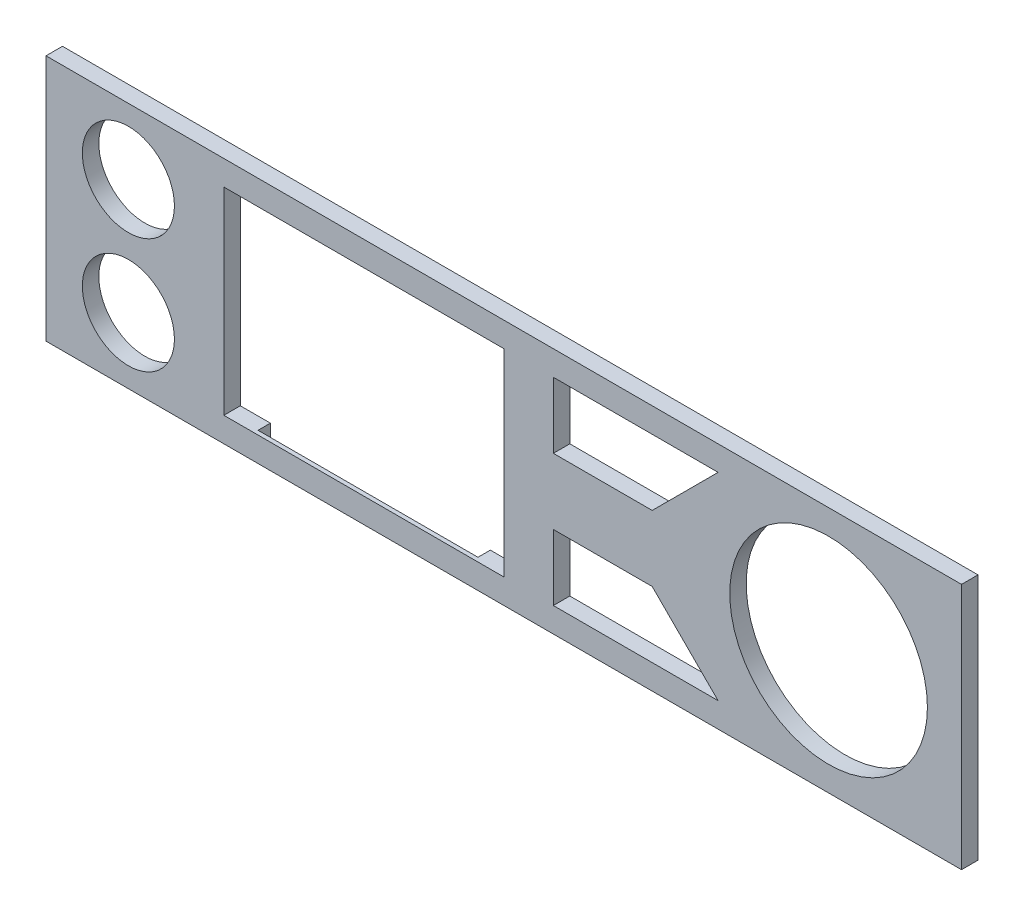
ISO-10303-21;
HEADER;
FILE_DESCRIPTION(('STEP AP214'),'2;1');
FILE_NAME('part.step','',(''),(''),'','','');
FILE_SCHEMA(('AUTOMOTIVE_DESIGN { 1 0 10303 214 1 1 1 1 }'));
ENDSEC;
DATA;
#1=APPLICATION_CONTEXT('core data for automotive mechanical design processes');
#2=APPLICATION_PROTOCOL_DEFINITION('international standard','automotive_design',2000,#1);
#3=PRODUCT_CONTEXT('',#1,'mechanical');
#4=PRODUCT('Part','Part','',(#3));
#5=PRODUCT_RELATED_PRODUCT_CATEGORY('part','',(#4));
#6=PRODUCT_DEFINITION_FORMATION('','',#4);
#7=PRODUCT_DEFINITION_CONTEXT('part definition',#1,'design');
#8=PRODUCT_DEFINITION('design','',#6,#7);
#9=PRODUCT_DEFINITION_SHAPE('','',#8);
#10=(LENGTH_UNIT() NAMED_UNIT(*) SI_UNIT(.MILLI.,.METRE.));
#11=(NAMED_UNIT(*) PLANE_ANGLE_UNIT() SI_UNIT($,.RADIAN.));
#12=(NAMED_UNIT(*) SI_UNIT($,.STERADIAN.) SOLID_ANGLE_UNIT());
#13=UNCERTAINTY_MEASURE_WITH_UNIT(LENGTH_MEASURE(1.E-05),#10,'distance_accuracy_value','');
#14=(GEOMETRIC_REPRESENTATION_CONTEXT(3) GLOBAL_UNCERTAINTY_ASSIGNED_CONTEXT((#13)) GLOBAL_UNIT_ASSIGNED_CONTEXT((#10,
#11,#12)) REPRESENTATION_CONTEXT('',''));
#15=CARTESIAN_POINT('',(0.,0.,0.));
#16=DIRECTION('',(0.,0.,1.));
#17=DIRECTION('',(1.,0.,0.));
#18=AXIS2_PLACEMENT_3D('',#15,#16,#17);
#19=CARTESIAN_POINT('',(0.,0.,2.));
#20=DIRECTION('',(0.,0.,1.));
#21=DIRECTION('',(1.,0.,0.));
#22=AXIS2_PLACEMENT_3D('',#19,#20,#21);
#23=PLANE('',#22);
#24=DIRECTION('',(1.,0.,0.));
#25=VECTOR('',#24,1.);
#26=CARTESIAN_POINT('',(-49.55,2.99999999999999,2.));
#27=LINE('',#26,#25);
#28=CARTESIAN_POINT('',(-49.55,2.99999999999999,2.));
#29=VERTEX_POINT('',#28);
#30=CARTESIAN_POINT('',(-29.55,2.99999999999999,2.));
#31=VERTEX_POINT('',#30);
#32=EDGE_CURVE('E244',#29,#31,#27,.T.);
#33=ORIENTED_EDGE('',*,*,#32,.F.);
#34=DIRECTION('',(0.,-1.,0.));
#35=VECTOR('',#34,1.);
#36=CARTESIAN_POINT('',(-49.55,2.99999999999999,2.));
#37=LINE('',#36,#35);
#38=CARTESIAN_POINT('',(-49.55,11.,2.));
#39=VERTEX_POINT('',#38);
#40=EDGE_CURVE('E242',#39,#29,#37,.T.);
#41=ORIENTED_EDGE('',*,*,#40,.F.);
#42=DIRECTION('',(-1.,0.,0.));
#43=VECTOR('',#42,1.);
#44=CARTESIAN_POINT('',(-49.55,11.,2.));
#45=LINE('',#44,#43);
#46=CARTESIAN_POINT('',(-37.55,11.,2.));
#47=VERTEX_POINT('',#46);
#48=EDGE_CURVE('E250',#47,#39,#45,.T.);
#49=ORIENTED_EDGE('',*,*,#48,.F.);
#50=DIRECTION('',(-0.707106781186548,0.707106781186548,0.));
#51=VECTOR('',#50,1.);
#52=CARTESIAN_POINT('',(-37.55,11.,2.));
#53=LINE('',#52,#51);
#54=EDGE_CURVE('E247',#31,#47,#53,.T.);
#55=ORIENTED_EDGE('',*,*,#54,.F.);
#56=EDGE_LOOP('',(#33,#41,#49,#55));
#57=FACE_BOUND('',#56,.T.);
#58=DIRECTION('',(1.,0.,0.));
#59=VECTOR('',#58,1.);
#60=CARTESIAN_POINT('',(-49.55,19.,2.));
#61=LINE('',#60,#59);
#62=CARTESIAN_POINT('',(-49.55,19.,2.));
#63=VERTEX_POINT('',#62);
#64=CARTESIAN_POINT('',(-37.55,19.,2.));
#65=VERTEX_POINT('',#64);
#66=EDGE_CURVE('E275',#63,#65,#61,.T.);
#67=ORIENTED_EDGE('',*,*,#66,.F.);
#68=DIRECTION('',(0.,-1.,0.));
#69=VECTOR('',#68,1.);
#70=CARTESIAN_POINT('',(-49.55,27.,2.));
#71=LINE('',#70,#69);
#72=CARTESIAN_POINT('',(-49.55,27.,2.));
#73=VERTEX_POINT('',#72);
#74=EDGE_CURVE('E273',#73,#63,#71,.T.);
#75=ORIENTED_EDGE('',*,*,#74,.F.);
#76=DIRECTION('',(-1.,0.,0.));
#77=VECTOR('',#76,1.);
#78=CARTESIAN_POINT('',(-36.596,27.,2.));
#79=LINE('',#78,#77);
#80=CARTESIAN_POINT('',(-29.55,27.,2.));
#81=VERTEX_POINT('',#80);
#82=EDGE_CURVE('E281',#81,#73,#79,.T.);
#83=ORIENTED_EDGE('',*,*,#82,.F.);
#84=DIRECTION('',(0.707106781186548,0.707106781186547,0.));
#85=VECTOR('',#84,1.);
#86=CARTESIAN_POINT('',(-29.55,27.,2.));
#87=LINE('',#86,#85);
#88=EDGE_CURVE('E278',#65,#81,#87,.T.);
#89=ORIENTED_EDGE('',*,*,#88,.F.);
#90=EDGE_LOOP('',(#67,#75,#83,#89));
#91=FACE_BOUND('',#90,.T.);
#92=CARTESIAN_POINT('',(-101.14,7.99999999999999,2.));
#93=DIRECTION('',(0.,0.,1.));
#94=DIRECTION('',(1.,0.,0.));
#95=AXIS2_PLACEMENT_3D('',#92,#93,#94);
#96=CIRCLE('',#95,5.59);
#97=CARTESIAN_POINT('',(-95.55,7.99999999999999,2.));
#98=VERTEX_POINT('',#97);
#99=EDGE_CURVE('E305',#98,#98,#96,.T.);
#100=ORIENTED_EDGE('',*,*,#99,.F.);
#101=EDGE_LOOP('',(#100));
#102=FACE_BOUND('',#101,.T.);
#103=DIRECTION('',(0.,1.,0.));
#104=VECTOR('',#103,1.);
#105=CARTESIAN_POINT('',(0.,0.,2.));
#106=LINE('',#105,#104);
#107=CARTESIAN_POINT('',(0.,0.,2.));
#108=VERTEX_POINT('',#107);
#109=CARTESIAN_POINT('',(0.,30.,2.));
#110=VERTEX_POINT('',#109);
#111=EDGE_CURVE('E317',#108,#110,#106,.T.);
#112=ORIENTED_EDGE('',*,*,#111,.T.);
#113=DIRECTION('',(-1.,0.,0.));
#114=VECTOR('',#113,1.);
#115=CARTESIAN_POINT('',(0.,30.,2.));
#116=LINE('',#115,#114);
#117=CARTESIAN_POINT('',(-111.14,30.,2.));
#118=VERTEX_POINT('',#117);
#119=EDGE_CURVE('E320',#110,#118,#116,.T.);
#120=ORIENTED_EDGE('',*,*,#119,.T.);
#121=DIRECTION('',(0.,-1.,0.));
#122=VECTOR('',#121,1.);
#123=CARTESIAN_POINT('',(-111.14,0.,2.));
#124=LINE('',#123,#122);
#125=CARTESIAN_POINT('',(-111.14,0.,2.));
#126=VERTEX_POINT('',#125);
#127=EDGE_CURVE('E323',#118,#126,#124,.T.);
#128=ORIENTED_EDGE('',*,*,#127,.T.);
#129=DIRECTION('',(1.,0.,0.));
#130=VECTOR('',#129,1.);
#131=CARTESIAN_POINT('',(0.,0.,2.));
#132=LINE('',#131,#130);
#133=EDGE_CURVE('E325',#126,#108,#132,.T.);
#134=ORIENTED_EDGE('',*,*,#133,.T.);
#135=EDGE_LOOP('',(#112,#120,#128,#134));
#136=FACE_BOUND('',#135,.T.);
#137=CARTESIAN_POINT('',(-101.14,22.,2.));
#138=DIRECTION('',(0.,0.,1.));
#139=DIRECTION('',(1.,0.,0.));
#140=AXIS2_PLACEMENT_3D('',#137,#138,#139);
#141=CIRCLE('',#140,5.59);
#142=CARTESIAN_POINT('',(-95.55,22.,2.));
#143=VERTEX_POINT('',#142);
#144=EDGE_CURVE('E311',#143,#143,#141,.T.);
#145=ORIENTED_EDGE('',*,*,#144,.F.);
#146=EDGE_LOOP('',(#145));
#147=FACE_BOUND('',#146,.T.);
#148=CARTESIAN_POINT('',(-16.14,15.,2.));
#149=DIRECTION('',(0.,0.,1.));
#150=DIRECTION('',(1.,0.,0.));
#151=AXIS2_PLACEMENT_3D('',#148,#149,#150);
#152=CIRCLE('',#151,12.);
#153=CARTESIAN_POINT('',(-4.14,15.,2.));
#154=VERTEX_POINT('',#153);
#155=EDGE_CURVE('E236',#154,#154,#152,.T.);
#156=ORIENTED_EDGE('',*,*,#155,.F.);
#157=EDGE_LOOP('',(#156));
#158=FACE_BOUND('',#157,.T.);
#159=DIRECTION('',(1.,0.,0.));
#160=VECTOR('',#159,1.);
#161=CARTESIAN_POINT('',(-89.55,2.99999999999999,2.));
#162=LINE('',#161,#160);
#163=CARTESIAN_POINT('',(-89.55,2.99999999999999,2.));
#164=VERTEX_POINT('',#163);
#165=CARTESIAN_POINT('',(-55.55,2.99999999999999,2.));
#166=VERTEX_POINT('',#165);
#167=EDGE_CURVE('E207',#164,#166,#162,.T.);
#168=ORIENTED_EDGE('',*,*,#167,.F.);
#169=DIRECTION('',(0.,-1.,0.));
#170=VECTOR('',#169,1.);
#171=CARTESIAN_POINT('',(-89.55,27.,2.));
#172=LINE('',#171,#170);
#173=CARTESIAN_POINT('',(-89.55,27.,2.));
#174=VERTEX_POINT('',#173);
#175=EDGE_CURVE('E205',#174,#164,#172,.T.);
#176=ORIENTED_EDGE('',*,*,#175,.F.);
#177=DIRECTION('',(-1.,0.,0.));
#178=VECTOR('',#177,1.);
#179=CARTESIAN_POINT('',(-89.55,27.,2.));
#180=LINE('',#179,#178);
#181=CARTESIAN_POINT('',(-55.55,27.,2.));
#182=VERTEX_POINT('',#181);
#183=EDGE_CURVE('E212',#182,#174,#180,.T.);
#184=ORIENTED_EDGE('',*,*,#183,.F.);
#185=DIRECTION('',(0.,1.,0.));
#186=VECTOR('',#185,1.);
#187=CARTESIAN_POINT('',(-55.55,27.,2.));
#188=LINE('',#187,#186);
#189=EDGE_CURVE('E210',#166,#182,#188,.T.);
#190=ORIENTED_EDGE('',*,*,#189,.F.);
#191=EDGE_LOOP('',(#168,#176,#184,#190));
#192=FACE_BOUND('',#191,.T.);
#193=ADVANCED_FACE('F32',(#57,#91,#102,#136,#147,#158,#192),#23,.T.);
#194=CARTESIAN_POINT('',(0.,0.,0.));
#195=DIRECTION('',(0.,0.,1.));
#196=DIRECTION('',(1.,0.,0.));
#197=AXIS2_PLACEMENT_3D('',#194,#195,#196);
#198=PLANE('',#197);
#199=CARTESIAN_POINT('',(-16.14,15.,0.));
#200=DIRECTION('',(0.,0.,1.));
#201=DIRECTION('',(1.,0.,0.));
#202=AXIS2_PLACEMENT_3D('',#199,#200,#201);
#203=CIRCLE('',#202,12.);
#204=CARTESIAN_POINT('',(-4.14,15.,0.));
#205=VERTEX_POINT('',#204);
#206=EDGE_CURVE('E235',#205,#205,#203,.T.);
#207=ORIENTED_EDGE('',*,*,#206,.T.);
#208=EDGE_LOOP('',(#207));
#209=FACE_BOUND('',#208,.T.);
#210=DIRECTION('',(0.,-1.,0.));
#211=VECTOR('',#210,1.);
#212=CARTESIAN_POINT('',(-49.55,2.99999999999999,0.));
#213=LINE('',#212,#211);
#214=CARTESIAN_POINT('',(-49.55,11.,0.));
#215=VERTEX_POINT('',#214);
#216=CARTESIAN_POINT('',(-49.55,2.99999999999999,0.));
#217=VERTEX_POINT('',#216);
#218=EDGE_CURVE('E239',#215,#217,#213,.T.);
#219=ORIENTED_EDGE('',*,*,#218,.T.);
#220=DIRECTION('',(1.,0.,0.));
#221=VECTOR('',#220,1.);
#222=CARTESIAN_POINT('',(-29.55,2.99999999999999,0.));
#223=LINE('',#222,#221);
#224=CARTESIAN_POINT('',(-29.55,2.99999999999999,0.));
#225=VERTEX_POINT('',#224);
#226=EDGE_CURVE('E255',#217,#225,#223,.T.);
#227=ORIENTED_EDGE('',*,*,#226,.T.);
#228=DIRECTION('',(-0.707106781186548,0.707106781186548,0.));
#229=VECTOR('',#228,1.);
#230=CARTESIAN_POINT('',(-37.55,11.,0.));
#231=LINE('',#230,#229);
#232=CARTESIAN_POINT('',(-37.55,11.,0.));
#233=VERTEX_POINT('',#232);
#234=EDGE_CURVE('E258',#225,#233,#231,.T.);
#235=ORIENTED_EDGE('',*,*,#234,.T.);
#236=DIRECTION('',(-1.,0.,0.));
#237=VECTOR('',#236,1.);
#238=CARTESIAN_POINT('',(-49.55,11.,0.));
#239=LINE('',#238,#237);
#240=EDGE_CURVE('E245',#233,#215,#239,.T.);
#241=ORIENTED_EDGE('',*,*,#240,.T.);
#242=EDGE_LOOP('',(#219,#227,#235,#241));
#243=FACE_BOUND('',#242,.T.);
#244=CARTESIAN_POINT('',(-101.14,7.99999999999999,0.));
#245=DIRECTION('',(0.,0.,1.));
#246=DIRECTION('',(1.,0.,0.));
#247=AXIS2_PLACEMENT_3D('',#244,#245,#246);
#248=CIRCLE('',#247,5.59);
#249=CARTESIAN_POINT('',(-95.55,7.99999999999999,0.));
#250=VERTEX_POINT('',#249);
#251=EDGE_CURVE('E304',#250,#250,#248,.T.);
#252=ORIENTED_EDGE('',*,*,#251,.T.);
#253=EDGE_LOOP('',(#252));
#254=FACE_BOUND('',#253,.T.);
#255=CARTESIAN_POINT('',(-101.14,22.,0.));
#256=DIRECTION('',(0.,0.,1.));
#257=DIRECTION('',(1.,0.,0.));
#258=AXIS2_PLACEMENT_3D('',#255,#256,#257);
#259=CIRCLE('',#258,5.59);
#260=CARTESIAN_POINT('',(-95.55,22.,0.));
#261=VERTEX_POINT('',#260);
#262=EDGE_CURVE('E308',#261,#261,#259,.T.);
#263=ORIENTED_EDGE('',*,*,#262,.T.);
#264=EDGE_LOOP('',(#263));
#265=FACE_BOUND('',#264,.T.);
#266=DIRECTION('',(0.,1.,0.));
#267=VECTOR('',#266,1.);
#268=CARTESIAN_POINT('',(0.,0.,0.));
#269=LINE('',#268,#267);
#270=CARTESIAN_POINT('',(0.,0.,0.));
#271=VERTEX_POINT('',#270);
#272=CARTESIAN_POINT('',(0.,30.,0.));
#273=VERTEX_POINT('',#272);
#274=EDGE_CURVE('E314',#271,#273,#269,.T.);
#275=ORIENTED_EDGE('',*,*,#274,.F.);
#276=DIRECTION('',(1.,0.,0.));
#277=VECTOR('',#276,1.);
#278=CARTESIAN_POINT('',(0.,0.,0.));
#279=LINE('',#278,#277);
#280=CARTESIAN_POINT('',(-111.14,0.,0.));
#281=VERTEX_POINT('',#280);
#282=EDGE_CURVE('E321',#281,#271,#279,.T.);
#283=ORIENTED_EDGE('',*,*,#282,.F.);
#284=DIRECTION('',(0.,-1.,0.));
#285=VECTOR('',#284,1.);
#286=CARTESIAN_POINT('',(-111.14,0.,0.));
#287=LINE('',#286,#285);
#288=CARTESIAN_POINT('',(-111.14,30.,0.));
#289=VERTEX_POINT('',#288);
#290=EDGE_CURVE('E332',#289,#281,#287,.T.);
#291=ORIENTED_EDGE('',*,*,#290,.F.);
#292=DIRECTION('',(-1.,0.,0.));
#293=VECTOR('',#292,1.);
#294=CARTESIAN_POINT('',(0.,30.,0.));
#295=LINE('',#294,#293);
#296=EDGE_CURVE('E330',#273,#289,#295,.T.);
#297=ORIENTED_EDGE('',*,*,#296,.F.);
#298=EDGE_LOOP('',(#275,#283,#291,#297));
#299=FACE_BOUND('',#298,.T.);
#300=DIRECTION('',(0.,-1.,0.));
#301=VECTOR('',#300,1.);
#302=CARTESIAN_POINT('',(-49.55,27.,0.));
#303=LINE('',#302,#301);
#304=CARTESIAN_POINT('',(-49.55,27.,0.));
#305=VERTEX_POINT('',#304);
#306=CARTESIAN_POINT('',(-49.55,19.,0.));
#307=VERTEX_POINT('',#306);
#308=EDGE_CURVE('E272',#305,#307,#303,.T.);
#309=ORIENTED_EDGE('',*,*,#308,.T.);
#310=DIRECTION('',(1.,0.,0.));
#311=VECTOR('',#310,1.);
#312=CARTESIAN_POINT('',(-49.55,19.,0.));
#313=LINE('',#312,#311);
#314=CARTESIAN_POINT('',(-37.55,19.,0.));
#315=VERTEX_POINT('',#314);
#316=EDGE_CURVE('E286',#307,#315,#313,.T.);
#317=ORIENTED_EDGE('',*,*,#316,.T.);
#318=DIRECTION('',(0.707106781186548,0.707106781186547,0.));
#319=VECTOR('',#318,1.);
#320=CARTESIAN_POINT('',(-29.55,27.,0.));
#321=LINE('',#320,#319);
#322=CARTESIAN_POINT('',(-29.55,27.,0.));
#323=VERTEX_POINT('',#322);
#324=EDGE_CURVE('E289',#315,#323,#321,.T.);
#325=ORIENTED_EDGE('',*,*,#324,.T.);
#326=DIRECTION('',(-1.,0.,0.));
#327=VECTOR('',#326,1.);
#328=CARTESIAN_POINT('',(-49.55,27.,0.));
#329=LINE('',#328,#327);
#330=EDGE_CURVE('E276',#323,#305,#329,.T.);
#331=ORIENTED_EDGE('',*,*,#330,.T.);
#332=EDGE_LOOP('',(#309,#317,#325,#331));
#333=FACE_BOUND('',#332,.T.);
#334=DIRECTION('',(-1.,0.,0.));
#335=VECTOR('',#334,1.);
#336=CARTESIAN_POINT('',(-59.2,0.749999999999989,0.));
#337=LINE('',#336,#335);
#338=CARTESIAN_POINT('',(-59.2,0.749999999999989,0.));
#339=VERTEX_POINT('',#338);
#340=CARTESIAN_POINT('',(-85.9,0.749999999999989,0.));
#341=VERTEX_POINT('',#340);
#342=EDGE_CURVE('E191',#339,#341,#337,.T.);
#343=ORIENTED_EDGE('',*,*,#342,.F.);
#344=DIRECTION('',(0.,-1.,0.));
#345=VECTOR('',#344,1.);
#346=CARTESIAN_POINT('',(-59.2,2.99999999999999,0.));
#347=LINE('',#346,#345);
#348=CARTESIAN_POINT('',(-59.2,2.99999999999999,0.));
#349=VERTEX_POINT('',#348);
#350=EDGE_CURVE('E176',#349,#339,#347,.T.);
#351=ORIENTED_EDGE('',*,*,#350,.F.);
#352=DIRECTION('',(1.,0.,0.));
#353=VECTOR('',#352,1.);
#354=CARTESIAN_POINT('',(-89.55,2.99999999999999,0.));
#355=LINE('',#354,#353);
#356=CARTESIAN_POINT('',(-55.55,2.99999999999999,0.));
#357=VERTEX_POINT('',#356);
#358=EDGE_CURVE('E217',#349,#357,#355,.T.);
#359=ORIENTED_EDGE('',*,*,#358,.T.);
#360=DIRECTION('',(0.,1.,0.));
#361=VECTOR('',#360,1.);
#362=CARTESIAN_POINT('',(-55.55,27.,0.));
#363=LINE('',#362,#361);
#364=CARTESIAN_POINT('',(-55.55,27.,0.));
#365=VERTEX_POINT('',#364);
#366=EDGE_CURVE('E221',#357,#365,#363,.T.);
#367=ORIENTED_EDGE('',*,*,#366,.T.);
#368=DIRECTION('',(-1.,0.,0.));
#369=VECTOR('',#368,1.);
#370=CARTESIAN_POINT('',(-89.55,27.,0.));
#371=LINE('',#370,#369);
#372=CARTESIAN_POINT('',(-89.55,27.,0.));
#373=VERTEX_POINT('',#372);
#374=EDGE_CURVE('E208',#365,#373,#371,.T.);
#375=ORIENTED_EDGE('',*,*,#374,.T.);
#376=DIRECTION('',(0.,-1.,0.));
#377=VECTOR('',#376,1.);
#378=CARTESIAN_POINT('',(-89.55,27.,0.));
#379=LINE('',#378,#377);
#380=CARTESIAN_POINT('',(-89.55,2.99999999999999,0.));
#381=VERTEX_POINT('',#380);
#382=EDGE_CURVE('E200',#373,#381,#379,.T.);
#383=ORIENTED_EDGE('',*,*,#382,.T.);
#384=CARTESIAN_POINT('',(-85.9,2.99999999999999,0.));
#385=VERTEX_POINT('',#384);
#386=EDGE_CURVE('E218',#381,#385,#355,.T.);
#387=ORIENTED_EDGE('',*,*,#386,.T.);
#388=DIRECTION('',(0.,1.,0.));
#389=VECTOR('',#388,1.);
#390=CARTESIAN_POINT('',(-85.9,2.99999999999999,0.));
#391=LINE('',#390,#389);
#392=EDGE_CURVE('E189',#341,#385,#391,.T.);
#393=ORIENTED_EDGE('',*,*,#392,.F.);
#394=EDGE_LOOP('',(#343,#351,#359,#367,#375,#383,#387,#393));
#395=FACE_BOUND('',#394,.T.);
#396=ADVANCED_FACE('F350',(#209,#243,#254,#265,#299,#333,#395),#198,.F.);
#397=CARTESIAN_POINT('',(0.,0.,2.));
#398=DIRECTION('',(-1.,0.,0.));
#399=DIRECTION('',(0.,-1.,0.));
#400=AXIS2_PLACEMENT_3D('',#397,#398,#399);
#401=PLANE('',#400);
#402=ORIENTED_EDGE('',*,*,#274,.T.);
#403=DIRECTION('',(0.,0.,-1.));
#404=VECTOR('',#403,1.);
#405=CARTESIAN_POINT('',(0.,30.,2.));
#406=LINE('',#405,#404);
#407=EDGE_CURVE('E11',#110,#273,#406,.T.);
#408=ORIENTED_EDGE('',*,*,#407,.F.);
#409=ORIENTED_EDGE('',*,*,#111,.F.);
#410=DIRECTION('',(0.,0.,-1.));
#411=VECTOR('',#410,1.);
#412=CARTESIAN_POINT('',(0.,0.,2.));
#413=LINE('',#412,#411);
#414=EDGE_CURVE('E327',#108,#271,#413,.T.);
#415=ORIENTED_EDGE('',*,*,#414,.T.);
#416=EDGE_LOOP('',(#402,#408,#409,#415));
#417=FACE_BOUND('',#416,.T.);
#418=ADVANCED_FACE('F34',(#417),#401,.F.);
#419=CARTESIAN_POINT('',(0.,30.,2.));
#420=DIRECTION('',(0.,-1.,0.));
#421=DIRECTION('',(1.,0.,0.));
#422=AXIS2_PLACEMENT_3D('',#419,#420,#421);
#423=PLANE('',#422);
#424=ORIENTED_EDGE('',*,*,#296,.T.);
#425=DIRECTION('',(0.,0.,-1.));
#426=VECTOR('',#425,1.);
#427=CARTESIAN_POINT('',(-111.14,30.,2.));
#428=LINE('',#427,#426);
#429=EDGE_CURVE('E40',#118,#289,#428,.T.);
#430=ORIENTED_EDGE('',*,*,#429,.F.);
#431=ORIENTED_EDGE('',*,*,#119,.F.);
#432=ORIENTED_EDGE('',*,*,#407,.T.);
#433=EDGE_LOOP('',(#424,#430,#431,#432));
#434=FACE_BOUND('',#433,.T.);
#435=ADVANCED_FACE('F361',(#434),#423,.F.);
#436=CARTESIAN_POINT('',(-111.14,0.,2.));
#437=DIRECTION('',(1.,0.,0.));
#438=DIRECTION('',(0.,0.,-1.));
#439=AXIS2_PLACEMENT_3D('',#436,#437,#438);
#440=PLANE('',#439);
#441=ORIENTED_EDGE('',*,*,#290,.T.);
#442=DIRECTION('',(0.,0.,-1.));
#443=VECTOR('',#442,1.);
#444=CARTESIAN_POINT('',(-111.14,0.,2.));
#445=LINE('',#444,#443);
#446=EDGE_CURVE('E337',#126,#281,#445,.T.);
#447=ORIENTED_EDGE('',*,*,#446,.F.);
#448=ORIENTED_EDGE('',*,*,#127,.F.);
#449=ORIENTED_EDGE('',*,*,#429,.T.);
#450=EDGE_LOOP('',(#441,#447,#448,#449));
#451=FACE_BOUND('',#450,.T.);
#452=ADVANCED_FACE('F344',(#451),#440,.F.);
#453=CARTESIAN_POINT('',(0.,0.,2.));
#454=DIRECTION('',(0.,1.,0.));
#455=DIRECTION('',(-1.,0.,0.));
#456=AXIS2_PLACEMENT_3D('',#453,#454,#455);
#457=PLANE('',#456);
#458=ORIENTED_EDGE('',*,*,#282,.T.);
#459=ORIENTED_EDGE('',*,*,#414,.F.);
#460=ORIENTED_EDGE('',*,*,#133,.F.);
#461=ORIENTED_EDGE('',*,*,#446,.T.);
#462=EDGE_LOOP('',(#458,#459,#460,#461));
#463=FACE_BOUND('',#462,.T.);
#464=ADVANCED_FACE('F354',(#463),#457,.F.);
#465=CARTESIAN_POINT('',(-101.14,22.,2.));
#466=DIRECTION('',(0.,0.,-1.));
#467=DIRECTION('',(-1.,0.,0.));
#468=AXIS2_PLACEMENT_3D('',#465,#466,#467);
#469=CYLINDRICAL_SURFACE('',#468,5.59);
#470=ORIENTED_EDGE('',*,*,#144,.T.);
#471=EDGE_LOOP('',(#470));
#472=FACE_BOUND('',#471,.T.);
#473=ORIENTED_EDGE('',*,*,#262,.F.);
#474=EDGE_LOOP('',(#473));
#475=FACE_BOUND('',#474,.T.);
#476=ADVANCED_FACE('F379',(#472,#475),#469,.F.);
#477=CARTESIAN_POINT('',(-101.14,7.99999999999999,2.));
#478=DIRECTION('',(0.,0.,-1.));
#479=DIRECTION('',(-1.,0.,0.));
#480=AXIS2_PLACEMENT_3D('',#477,#478,#479);
#481=CYLINDRICAL_SURFACE('',#480,5.59);
#482=ORIENTED_EDGE('',*,*,#99,.T.);
#483=EDGE_LOOP('',(#482));
#484=FACE_BOUND('',#483,.T.);
#485=ORIENTED_EDGE('',*,*,#251,.F.);
#486=EDGE_LOOP('',(#485));
#487=FACE_BOUND('',#486,.T.);
#488=ADVANCED_FACE('F386',(#484,#487),#481,.F.);
#489=CARTESIAN_POINT('',(-49.55,27.,2.));
#490=DIRECTION('',(1.,0.,0.));
#491=DIRECTION('',(0.,1.,0.));
#492=AXIS2_PLACEMENT_3D('',#489,#490,#491);
#493=PLANE('',#492);
#494=ORIENTED_EDGE('',*,*,#308,.F.);
#495=DIRECTION('',(0.,0.,-1.));
#496=VECTOR('',#495,1.);
#497=CARTESIAN_POINT('',(-49.55,27.,2.));
#498=LINE('',#497,#496);
#499=EDGE_CURVE('E283',#73,#305,#498,.T.);
#500=ORIENTED_EDGE('',*,*,#499,.F.);
#501=ORIENTED_EDGE('',*,*,#74,.T.);
#502=DIRECTION('',(0.,0.,-1.));
#503=VECTOR('',#502,1.);
#504=CARTESIAN_POINT('',(-49.55,19.,2.));
#505=LINE('',#504,#503);
#506=EDGE_CURVE('E301',#63,#307,#505,.T.);
#507=ORIENTED_EDGE('',*,*,#506,.T.);
#508=EDGE_LOOP('',(#494,#500,#501,#507));
#509=FACE_BOUND('',#508,.T.);
#510=ADVANCED_FACE('F391',(#509),#493,.T.);
#511=CARTESIAN_POINT('',(-49.55,19.,2.));
#512=DIRECTION('',(0.,1.,0.));
#513=DIRECTION('',(-1.,0.,0.));
#514=AXIS2_PLACEMENT_3D('',#511,#512,#513);
#515=PLANE('',#514);
#516=ORIENTED_EDGE('',*,*,#316,.F.);
#517=ORIENTED_EDGE('',*,*,#506,.F.);
#518=ORIENTED_EDGE('',*,*,#66,.T.);
#519=DIRECTION('',(0.,0.,-1.));
#520=VECTOR('',#519,1.);
#521=CARTESIAN_POINT('',(-37.55,19.,2.));
#522=LINE('',#521,#520);
#523=EDGE_CURVE('E299',#65,#315,#522,.T.);
#524=ORIENTED_EDGE('',*,*,#523,.T.);
#525=EDGE_LOOP('',(#516,#517,#518,#524));
#526=FACE_BOUND('',#525,.T.);
#527=ADVANCED_FACE('F461',(#526),#515,.T.);
#528=CARTESIAN_POINT('',(-29.55,27.,2.));
#529=DIRECTION('',(-0.707106781186547,0.707106781186548,0.));
#530=DIRECTION('',(-0.707106781186548,-0.707106781186547,0.));
#531=AXIS2_PLACEMENT_3D('',#528,#529,#530);
#532=PLANE('',#531);
#533=ORIENTED_EDGE('',*,*,#324,.F.);
#534=ORIENTED_EDGE('',*,*,#523,.F.);
#535=ORIENTED_EDGE('',*,*,#88,.T.);
#536=DIRECTION('',(0.,0.,-1.));
#537=VECTOR('',#536,1.);
#538=CARTESIAN_POINT('',(-29.55,27.,2.));
#539=LINE('',#538,#537);
#540=EDGE_CURVE('E296',#81,#323,#539,.T.);
#541=ORIENTED_EDGE('',*,*,#540,.T.);
#542=EDGE_LOOP('',(#533,#534,#535,#541));
#543=FACE_BOUND('',#542,.T.);
#544=ADVANCED_FACE('F457',(#543),#532,.T.);
#545=CARTESIAN_POINT('',(-49.55,27.,2.));
#546=DIRECTION('',(0.,-1.,0.));
#547=DIRECTION('',(1.,0.,0.));
#548=AXIS2_PLACEMENT_3D('',#545,#546,#547);
#549=PLANE('',#548);
#550=ORIENTED_EDGE('',*,*,#330,.F.);
#551=ORIENTED_EDGE('',*,*,#540,.F.);
#552=ORIENTED_EDGE('',*,*,#82,.T.);
#553=ORIENTED_EDGE('',*,*,#499,.T.);
#554=EDGE_LOOP('',(#550,#551,#552,#553));
#555=FACE_BOUND('',#554,.T.);
#556=ADVANCED_FACE('F453',(#555),#549,.T.);
#557=CARTESIAN_POINT('',(-49.55,2.99999999999999,2.));
#558=DIRECTION('',(1.,0.,0.));
#559=DIRECTION('',(0.,1.,0.));
#560=AXIS2_PLACEMENT_3D('',#557,#558,#559);
#561=PLANE('',#560);
#562=ORIENTED_EDGE('',*,*,#218,.F.);
#563=DIRECTION('',(0.,0.,-1.));
#564=VECTOR('',#563,1.);
#565=CARTESIAN_POINT('',(-49.55,11.,2.));
#566=LINE('',#565,#564);
#567=EDGE_CURVE('E252',#39,#215,#566,.T.);
#568=ORIENTED_EDGE('',*,*,#567,.F.);
#569=ORIENTED_EDGE('',*,*,#40,.T.);
#570=DIRECTION('',(0.,0.,-1.));
#571=VECTOR('',#570,1.);
#572=CARTESIAN_POINT('',(-49.55,2.99999999999999,2.));
#573=LINE('',#572,#571);
#574=EDGE_CURVE('E269',#29,#217,#573,.T.);
#575=ORIENTED_EDGE('',*,*,#574,.T.);
#576=EDGE_LOOP('',(#562,#568,#569,#575));
#577=FACE_BOUND('',#576,.T.);
#578=ADVANCED_FACE('F449',(#577),#561,.T.);
#579=CARTESIAN_POINT('',(-29.55,2.99999999999999,2.));
#580=DIRECTION('',(0.,1.,0.));
#581=DIRECTION('',(-1.,0.,0.));
#582=AXIS2_PLACEMENT_3D('',#579,#580,#581);
#583=PLANE('',#582);
#584=ORIENTED_EDGE('',*,*,#226,.F.);
#585=ORIENTED_EDGE('',*,*,#574,.F.);
#586=ORIENTED_EDGE('',*,*,#32,.T.);
#587=DIRECTION('',(0.,0.,-1.));
#588=VECTOR('',#587,1.);
#589=CARTESIAN_POINT('',(-29.55,2.99999999999999,2.));
#590=LINE('',#589,#588);
#591=EDGE_CURVE('E267',#31,#225,#590,.T.);
#592=ORIENTED_EDGE('',*,*,#591,.T.);
#593=EDGE_LOOP('',(#584,#585,#586,#592));
#594=FACE_BOUND('',#593,.T.);
#595=ADVANCED_FACE('F445',(#594),#583,.T.);
#596=CARTESIAN_POINT('',(-37.55,11.,2.));
#597=DIRECTION('',(-0.707106781186547,-0.707106781186547,0.));
#598=DIRECTION('',(0.707106781186548,-0.707106781186548,0.));
#599=AXIS2_PLACEMENT_3D('',#596,#597,#598);
#600=PLANE('',#599);
#601=ORIENTED_EDGE('',*,*,#234,.F.);
#602=ORIENTED_EDGE('',*,*,#591,.F.);
#603=ORIENTED_EDGE('',*,*,#54,.T.);
#604=DIRECTION('',(0.,0.,-1.));
#605=VECTOR('',#604,1.);
#606=CARTESIAN_POINT('',(-37.55,11.,2.));
#607=LINE('',#606,#605);
#608=EDGE_CURVE('E265',#47,#233,#607,.T.);
#609=ORIENTED_EDGE('',*,*,#608,.T.);
#610=EDGE_LOOP('',(#601,#602,#603,#609));
#611=FACE_BOUND('',#610,.T.);
#612=ADVANCED_FACE('F441',(#611),#600,.T.);
#613=CARTESIAN_POINT('',(-49.55,11.,2.));
#614=DIRECTION('',(0.,-1.,0.));
#615=DIRECTION('',(0.,0.,-1.));
#616=AXIS2_PLACEMENT_3D('',#613,#614,#615);
#617=PLANE('',#616);
#618=ORIENTED_EDGE('',*,*,#240,.F.);
#619=ORIENTED_EDGE('',*,*,#608,.F.);
#620=ORIENTED_EDGE('',*,*,#48,.T.);
#621=ORIENTED_EDGE('',*,*,#567,.T.);
#622=EDGE_LOOP('',(#618,#619,#620,#621));
#623=FACE_BOUND('',#622,.T.);
#624=ADVANCED_FACE('F437',(#623),#617,.T.);
#625=CARTESIAN_POINT('',(-16.14,15.,2.));
#626=DIRECTION('',(0.,0.,-1.));
#627=DIRECTION('',(-1.,0.,0.));
#628=AXIS2_PLACEMENT_3D('',#625,#626,#627);
#629=CYLINDRICAL_SURFACE('',#628,12.);
#630=ORIENTED_EDGE('',*,*,#155,.T.);
#631=EDGE_LOOP('',(#630));
#632=FACE_BOUND('',#631,.T.);
#633=ORIENTED_EDGE('',*,*,#206,.F.);
#634=EDGE_LOOP('',(#633));
#635=FACE_BOUND('',#634,.T.);
#636=ADVANCED_FACE('F434',(#632,#635),#629,.F.);
#637=CARTESIAN_POINT('',(-89.55,27.,2.));
#638=DIRECTION('',(1.,0.,0.));
#639=DIRECTION('',(0.,0.,-1.));
#640=AXIS2_PLACEMENT_3D('',#637,#638,#639);
#641=PLANE('',#640);
#642=ORIENTED_EDGE('',*,*,#382,.F.);
#643=DIRECTION('',(0.,0.,-1.));
#644=VECTOR('',#643,1.);
#645=CARTESIAN_POINT('',(-89.55,27.,2.));
#646=LINE('',#645,#644);
#647=EDGE_CURVE('E214',#174,#373,#646,.T.);
#648=ORIENTED_EDGE('',*,*,#647,.F.);
#649=ORIENTED_EDGE('',*,*,#175,.T.);
#650=DIRECTION('',(0.,0.,-1.));
#651=VECTOR('',#650,1.);
#652=CARTESIAN_POINT('',(-89.55,2.99999999999999,2.));
#653=LINE('',#652,#651);
#654=EDGE_CURVE('E232',#164,#381,#653,.T.);
#655=ORIENTED_EDGE('',*,*,#654,.T.);
#656=EDGE_LOOP('',(#642,#648,#649,#655));
#657=FACE_BOUND('',#656,.T.);
#658=ADVANCED_FACE('F417',(#657),#641,.T.);
#659=CARTESIAN_POINT('',(-89.55,2.99999999999999,2.));
#660=DIRECTION('',(0.,1.,0.));
#661=DIRECTION('',(0.,0.,1.));
#662=AXIS2_PLACEMENT_3D('',#659,#660,#661);
#663=PLANE('',#662);
#664=DIRECTION('',(0.,0.,-1.));
#665=VECTOR('',#664,1.);
#666=CARTESIAN_POINT('',(-59.2,2.99999999999999,1.5));
#667=LINE('',#666,#665);
#668=CARTESIAN_POINT('',(-59.2,2.99999999999999,1.5));
#669=VERTEX_POINT('',#668);
#670=EDGE_CURVE('E198',#669,#349,#667,.T.);
#671=ORIENTED_EDGE('',*,*,#670,.F.);
#672=DIRECTION('',(1.,0.,0.));
#673=VECTOR('',#672,1.);
#674=CARTESIAN_POINT('',(-59.2,2.99999999999999,1.5));
#675=LINE('',#674,#673);
#676=CARTESIAN_POINT('',(-85.9,2.99999999999999,1.5));
#677=VERTEX_POINT('',#676);
#678=EDGE_CURVE('E181',#677,#669,#675,.T.);
#679=ORIENTED_EDGE('',*,*,#678,.F.);
#680=DIRECTION('',(0.,0.,-1.));
#681=VECTOR('',#680,1.);
#682=CARTESIAN_POINT('',(-85.9,2.99999999999999,1.5));
#683=LINE('',#682,#681);
#684=EDGE_CURVE('E201',#677,#385,#683,.T.);
#685=ORIENTED_EDGE('',*,*,#684,.T.);
#686=ORIENTED_EDGE('',*,*,#386,.F.);
#687=ORIENTED_EDGE('',*,*,#654,.F.);
#688=ORIENTED_EDGE('',*,*,#167,.T.);
#689=DIRECTION('',(0.,0.,-1.));
#690=VECTOR('',#689,1.);
#691=CARTESIAN_POINT('',(-55.55,2.99999999999999,2.));
#692=LINE('',#691,#690);
#693=EDGE_CURVE('E229',#166,#357,#692,.T.);
#694=ORIENTED_EDGE('',*,*,#693,.T.);
#695=ORIENTED_EDGE('',*,*,#358,.F.);
#696=EDGE_LOOP('',(#671,#679,#685,#686,#687,#688,#694,#695));
#697=FACE_BOUND('',#696,.T.);
#698=ADVANCED_FACE('F407',(#697),#663,.T.);
#699=CARTESIAN_POINT('',(-55.55,27.,2.));
#700=DIRECTION('',(-1.,0.,0.));
#701=DIRECTION('',(0.,0.,1.));
#702=AXIS2_PLACEMENT_3D('',#699,#700,#701);
#703=PLANE('',#702);
#704=ORIENTED_EDGE('',*,*,#366,.F.);
#705=ORIENTED_EDGE('',*,*,#693,.F.);
#706=ORIENTED_EDGE('',*,*,#189,.T.);
#707=DIRECTION('',(0.,0.,-1.));
#708=VECTOR('',#707,1.);
#709=CARTESIAN_POINT('',(-55.55,27.,2.));
#710=LINE('',#709,#708);
#711=EDGE_CURVE('E55',#182,#365,#710,.T.);
#712=ORIENTED_EDGE('',*,*,#711,.T.);
#713=EDGE_LOOP('',(#704,#705,#706,#712));
#714=FACE_BOUND('',#713,.T.);
#715=ADVANCED_FACE('F411',(#714),#703,.T.);
#716=CARTESIAN_POINT('',(-89.55,27.,2.));
#717=DIRECTION('',(0.,-1.,0.));
#718=DIRECTION('',(1.,0.,0.));
#719=AXIS2_PLACEMENT_3D('',#716,#717,#718);
#720=PLANE('',#719);
#721=ORIENTED_EDGE('',*,*,#374,.F.);
#722=ORIENTED_EDGE('',*,*,#711,.F.);
#723=ORIENTED_EDGE('',*,*,#183,.T.);
#724=ORIENTED_EDGE('',*,*,#647,.T.);
#725=EDGE_LOOP('',(#721,#722,#723,#724));
#726=FACE_BOUND('',#725,.T.);
#727=ADVANCED_FACE('F418',(#726),#720,.T.);
#728=CARTESIAN_POINT('',(-59.2,2.99999999999999,1.5));
#729=DIRECTION('',(1.,0.,0.));
#730=DIRECTION('',(0.,0.,-1.));
#731=AXIS2_PLACEMENT_3D('',#728,#729,#730);
#732=PLANE('',#731);
#733=ORIENTED_EDGE('',*,*,#350,.T.);
#734=DIRECTION('',(0.,0.,-1.));
#735=VECTOR('',#734,1.);
#736=CARTESIAN_POINT('',(-59.2,0.749999999999989,1.5));
#737=LINE('',#736,#735);
#738=CARTESIAN_POINT('',(-59.2,0.749999999999989,1.5));
#739=VERTEX_POINT('',#738);
#740=EDGE_CURVE('E170',#739,#339,#737,.T.);
#741=ORIENTED_EDGE('',*,*,#740,.F.);
#742=DIRECTION('',(0.,-1.,0.));
#743=VECTOR('',#742,1.);
#744=CARTESIAN_POINT('',(-59.2,2.99999999999999,1.5));
#745=LINE('',#744,#743);
#746=EDGE_CURVE('E174',#669,#739,#745,.T.);
#747=ORIENTED_EDGE('',*,*,#746,.F.);
#748=ORIENTED_EDGE('',*,*,#670,.T.);
#749=EDGE_LOOP('',(#733,#741,#747,#748));
#750=FACE_BOUND('',#749,.T.);
#751=ADVANCED_FACE('F172',(#750),#732,.F.);
#752=CARTESIAN_POINT('',(-85.9,2.99999999999999,1.5));
#753=DIRECTION('',(-1.,0.,0.));
#754=DIRECTION('',(0.,0.,1.));
#755=AXIS2_PLACEMENT_3D('',#752,#753,#754);
#756=PLANE('',#755);
#757=ORIENTED_EDGE('',*,*,#392,.T.);
#758=ORIENTED_EDGE('',*,*,#684,.F.);
#759=DIRECTION('',(0.,1.,0.));
#760=VECTOR('',#759,1.);
#761=CARTESIAN_POINT('',(-85.9,2.99999999999999,1.5));
#762=LINE('',#761,#760);
#763=CARTESIAN_POINT('',(-85.9,0.749999999999989,1.5));
#764=VERTEX_POINT('',#763);
#765=EDGE_CURVE('E47',#764,#677,#762,.T.);
#766=ORIENTED_EDGE('',*,*,#765,.F.);
#767=DIRECTION('',(0.,0.,-1.));
#768=VECTOR('',#767,1.);
#769=CARTESIAN_POINT('',(-85.9,0.749999999999989,1.5));
#770=LINE('',#769,#768);
#771=EDGE_CURVE('E180',#764,#341,#770,.T.);
#772=ORIENTED_EDGE('',*,*,#771,.T.);
#773=EDGE_LOOP('',(#757,#758,#766,#772));
#774=FACE_BOUND('',#773,.T.);
#775=ADVANCED_FACE('F425',(#774),#756,.F.);
#776=CARTESIAN_POINT('',(-59.2,0.749999999999989,1.5));
#777=DIRECTION('',(0.,-1.,0.));
#778=DIRECTION('',(0.,0.,-1.));
#779=AXIS2_PLACEMENT_3D('',#776,#777,#778);
#780=PLANE('',#779);
#781=ORIENTED_EDGE('',*,*,#342,.T.);
#782=ORIENTED_EDGE('',*,*,#771,.F.);
#783=DIRECTION('',(-1.,0.,0.));
#784=VECTOR('',#783,1.);
#785=CARTESIAN_POINT('',(-59.2,0.749999999999989,1.5));
#786=LINE('',#785,#784);
#787=EDGE_CURVE('E183',#739,#764,#786,.T.);
#788=ORIENTED_EDGE('',*,*,#787,.F.);
#789=ORIENTED_EDGE('',*,*,#740,.T.);
#790=EDGE_LOOP('',(#781,#782,#788,#789));
#791=FACE_BOUND('',#790,.T.);
#792=ADVANCED_FACE('F184',(#791),#780,.F.);
#793=CARTESIAN_POINT('',(0.,0.,1.5));
#794=DIRECTION('',(0.,0.,-1.));
#795=DIRECTION('',(-1.,0.,0.));
#796=AXIS2_PLACEMENT_3D('',#793,#794,#795);
#797=PLANE('',#796);
#798=ORIENTED_EDGE('',*,*,#746,.T.);
#799=ORIENTED_EDGE('',*,*,#787,.T.);
#800=ORIENTED_EDGE('',*,*,#765,.T.);
#801=ORIENTED_EDGE('',*,*,#678,.T.);
#802=EDGE_LOOP('',(#798,#799,#800,#801));
#803=FACE_BOUND('',#802,.T.);
#804=ADVANCED_FACE('F186',(#803),#797,.T.);
#805=CLOSED_SHELL('',(#193,#396,#418,#435,#452,#464,#476,#488,#510,#527,#544,#556,#578,#595,
#612,#624,#636,#658,#698,#715,#727,#751,#775,#792,#804));
#806=MANIFOLD_SOLID_BREP('B2',#805);
#807=ADVANCED_BREP_SHAPE_REPRESENTATION('',(#18,#806),#14);
#808=SHAPE_DEFINITION_REPRESENTATION(#9,#807);
ENDSEC;
END-ISO-10303-21;
